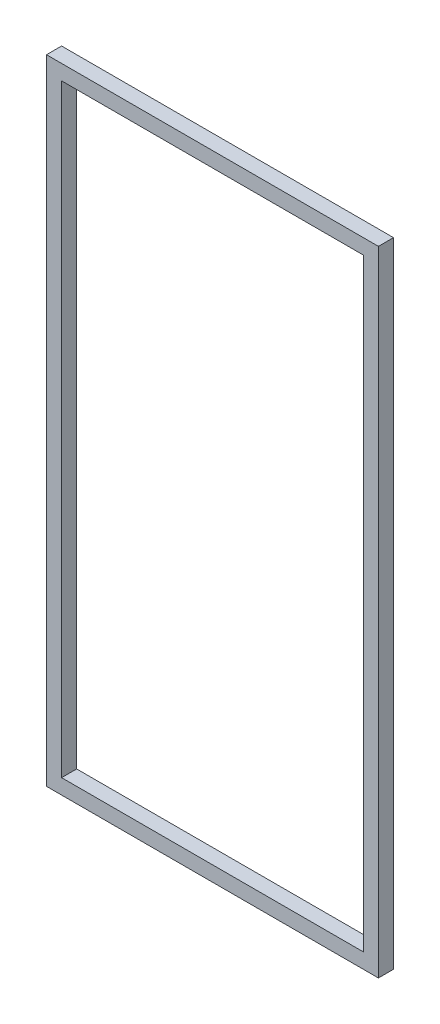
ISO-10303-21;
HEADER;
FILE_DESCRIPTION(('STEP AP214'),'2;1');
FILE_NAME('part.step','',(''),(''),'','','');
FILE_SCHEMA(('AUTOMOTIVE_DESIGN { 1 0 10303 214 1 1 1 1 }'));
ENDSEC;
DATA;
#1=APPLICATION_CONTEXT('core data for automotive mechanical design processes');
#2=APPLICATION_PROTOCOL_DEFINITION('international standard','automotive_design',2000,#1);
#3=PRODUCT_CONTEXT('',#1,'mechanical');
#4=PRODUCT('Part','Part','',(#3));
#5=PRODUCT_RELATED_PRODUCT_CATEGORY('part','',(#4));
#6=PRODUCT_DEFINITION_FORMATION('','',#4);
#7=PRODUCT_DEFINITION_CONTEXT('part definition',#1,'design');
#8=PRODUCT_DEFINITION('design','',#6,#7);
#9=PRODUCT_DEFINITION_SHAPE('','',#8);
#10=(LENGTH_UNIT() NAMED_UNIT(*) SI_UNIT(.MILLI.,.METRE.));
#11=(NAMED_UNIT(*) PLANE_ANGLE_UNIT() SI_UNIT($,.RADIAN.));
#12=(NAMED_UNIT(*) SI_UNIT($,.STERADIAN.) SOLID_ANGLE_UNIT());
#13=UNCERTAINTY_MEASURE_WITH_UNIT(LENGTH_MEASURE(1.E-05),#10,'distance_accuracy_value','');
#14=(GEOMETRIC_REPRESENTATION_CONTEXT(3) GLOBAL_UNCERTAINTY_ASSIGNED_CONTEXT((#13)) GLOBAL_UNIT_ASSIGNED_CONTEXT((#10,
#11,#12)) REPRESENTATION_CONTEXT('',''));
#15=CARTESIAN_POINT('',(0.,0.,0.));
#16=DIRECTION('',(0.,0.,1.));
#17=DIRECTION('',(1.,0.,0.));
#18=AXIS2_PLACEMENT_3D('',#15,#16,#17);
#19=CARTESIAN_POINT('',(-550.,-1050.,50.));
#20=DIRECTION('',(1.,0.,0.));
#21=DIRECTION('',(0.,0.,-1.));
#22=AXIS2_PLACEMENT_3D('',#19,#20,#21);
#23=PLANE('',#22);
#24=DIRECTION('',(0.,-1.,0.));
#25=VECTOR('',#24,1.);
#26=CARTESIAN_POINT('',(-550.,-1050.,0.));
#27=LINE('',#26,#25);
#28=CARTESIAN_POINT('',(-550.,1050.,0.));
#29=VERTEX_POINT('',#28);
#30=CARTESIAN_POINT('',(-550.,-1050.,0.));
#31=VERTEX_POINT('',#30);
#32=EDGE_CURVE('E130',#29,#31,#27,.T.);
#33=ORIENTED_EDGE('',*,*,#32,.T.);
#34=DIRECTION('',(0.,0.,-1.));
#35=VECTOR('',#34,1.);
#36=CARTESIAN_POINT('',(-550.,-1050.,50.));
#37=LINE('',#36,#35);
#38=CARTESIAN_POINT('',(-550.,-1050.,50.));
#39=VERTEX_POINT('',#38);
#40=EDGE_CURVE('E11',#39,#31,#37,.T.);
#41=ORIENTED_EDGE('',*,*,#40,.F.);
#42=DIRECTION('',(0.,-1.,0.));
#43=VECTOR('',#42,1.);
#44=CARTESIAN_POINT('',(-550.,-1050.,50.));
#45=LINE('',#44,#43);
#46=CARTESIAN_POINT('',(-550.,1050.,50.));
#47=VERTEX_POINT('',#46);
#48=EDGE_CURVE('E134',#47,#39,#45,.T.);
#49=ORIENTED_EDGE('',*,*,#48,.F.);
#50=DIRECTION('',(0.,0.,-1.));
#51=VECTOR('',#50,1.);
#52=CARTESIAN_POINT('',(-550.,1050.,50.));
#53=LINE('',#52,#51);
#54=EDGE_CURVE('E144',#47,#29,#53,.T.);
#55=ORIENTED_EDGE('',*,*,#54,.T.);
#56=EDGE_LOOP('',(#33,#41,#49,#55));
#57=FACE_BOUND('',#56,.T.);
#58=ADVANCED_FACE('F33',(#57),#23,.F.);
#59=CARTESIAN_POINT('',(550.,-1050.,50.));
#60=DIRECTION('',(0.,1.,0.));
#61=DIRECTION('',(-1.,0.,0.));
#62=AXIS2_PLACEMENT_3D('',#59,#60,#61);
#63=PLANE('',#62);
#64=DIRECTION('',(1.,0.,0.));
#65=VECTOR('',#64,1.);
#66=CARTESIAN_POINT('',(550.,-1050.,0.));
#67=LINE('',#66,#65);
#68=CARTESIAN_POINT('',(550.,-1050.,0.));
#69=VERTEX_POINT('',#68);
#70=EDGE_CURVE('E147',#31,#69,#67,.T.);
#71=ORIENTED_EDGE('',*,*,#70,.T.);
#72=DIRECTION('',(0.,0.,-1.));
#73=VECTOR('',#72,1.);
#74=CARTESIAN_POINT('',(550.,-1050.,50.));
#75=LINE('',#74,#73);
#76=CARTESIAN_POINT('',(550.,-1050.,50.));
#77=VERTEX_POINT('',#76);
#78=EDGE_CURVE('E40',#77,#69,#75,.T.);
#79=ORIENTED_EDGE('',*,*,#78,.F.);
#80=DIRECTION('',(1.,0.,0.));
#81=VECTOR('',#80,1.);
#82=CARTESIAN_POINT('',(550.,-1050.,50.));
#83=LINE('',#82,#81);
#84=EDGE_CURVE('E137',#39,#77,#83,.T.);
#85=ORIENTED_EDGE('',*,*,#84,.F.);
#86=ORIENTED_EDGE('',*,*,#40,.T.);
#87=EDGE_LOOP('',(#71,#79,#85,#86));
#88=FACE_BOUND('',#87,.T.);
#89=ADVANCED_FACE('F175',(#88),#63,.F.);
#90=CARTESIAN_POINT('',(550.,-1050.,50.));
#91=DIRECTION('',(-1.,0.,0.));
#92=DIRECTION('',(0.,0.,1.));
#93=AXIS2_PLACEMENT_3D('',#90,#91,#92);
#94=PLANE('',#93);
#95=DIRECTION('',(0.,1.,0.));
#96=VECTOR('',#95,1.);
#97=CARTESIAN_POINT('',(550.,-1050.,0.));
#98=LINE('',#97,#96);
#99=CARTESIAN_POINT('',(550.,1050.,0.));
#100=VERTEX_POINT('',#99);
#101=EDGE_CURVE('E149',#69,#100,#98,.T.);
#102=ORIENTED_EDGE('',*,*,#101,.T.);
#103=DIRECTION('',(0.,0.,-1.));
#104=VECTOR('',#103,1.);
#105=CARTESIAN_POINT('',(550.,1050.,50.));
#106=LINE('',#105,#104);
#107=CARTESIAN_POINT('',(550.,1050.,50.));
#108=VERTEX_POINT('',#107);
#109=EDGE_CURVE('E154',#108,#100,#106,.T.);
#110=ORIENTED_EDGE('',*,*,#109,.F.);
#111=DIRECTION('',(0.,1.,0.));
#112=VECTOR('',#111,1.);
#113=CARTESIAN_POINT('',(550.,-1050.,50.));
#114=LINE('',#113,#112);
#115=EDGE_CURVE('E140',#77,#108,#114,.T.);
#116=ORIENTED_EDGE('',*,*,#115,.F.);
#117=ORIENTED_EDGE('',*,*,#78,.T.);
#118=EDGE_LOOP('',(#102,#110,#116,#117));
#119=FACE_BOUND('',#118,.T.);
#120=ADVANCED_FACE('F161',(#119),#94,.F.);
#121=CARTESIAN_POINT('',(550.,1050.,50.));
#122=DIRECTION('',(0.,-1.,0.));
#123=DIRECTION('',(0.,0.,-1.));
#124=AXIS2_PLACEMENT_3D('',#121,#122,#123);
#125=PLANE('',#124);
#126=DIRECTION('',(-1.,0.,0.));
#127=VECTOR('',#126,1.);
#128=CARTESIAN_POINT('',(550.,1050.,0.));
#129=LINE('',#128,#127);
#130=EDGE_CURVE('E138',#100,#29,#129,.T.);
#131=ORIENTED_EDGE('',*,*,#130,.T.);
#132=ORIENTED_EDGE('',*,*,#54,.F.);
#133=DIRECTION('',(-1.,0.,0.));
#134=VECTOR('',#133,1.);
#135=CARTESIAN_POINT('',(550.,1050.,50.));
#136=LINE('',#135,#134);
#137=EDGE_CURVE('E142',#108,#47,#136,.T.);
#138=ORIENTED_EDGE('',*,*,#137,.F.);
#139=ORIENTED_EDGE('',*,*,#109,.T.);
#140=EDGE_LOOP('',(#131,#132,#138,#139));
#141=FACE_BOUND('',#140,.T.);
#142=ADVANCED_FACE('F168',(#141),#125,.F.);
#143=CARTESIAN_POINT('',(0.,0.,50.));
#144=DIRECTION('',(0.,0.,1.));
#145=DIRECTION('',(1.,0.,0.));
#146=AXIS2_PLACEMENT_3D('',#143,#144,#145);
#147=PLANE('',#146);
#148=DIRECTION('',(0.,-1.,0.));
#149=VECTOR('',#148,1.);
#150=CARTESIAN_POINT('',(-500.,-1000.,50.));
#151=LINE('',#150,#149);
#152=CARTESIAN_POINT('',(-500.,1000.,50.));
#153=VERTEX_POINT('',#152);
#154=CARTESIAN_POINT('',(-500.,-1000.,50.));
#155=VERTEX_POINT('',#154);
#156=EDGE_CURVE('E47',#153,#155,#151,.T.);
#157=ORIENTED_EDGE('',*,*,#156,.F.);
#158=DIRECTION('',(-1.,0.,0.));
#159=VECTOR('',#158,1.);
#160=CARTESIAN_POINT('',(500.,1000.,50.));
#161=LINE('',#160,#159);
#162=CARTESIAN_POINT('',(500.,1000.,50.));
#163=VERTEX_POINT('',#162);
#164=EDGE_CURVE('E115',#163,#153,#161,.T.);
#165=ORIENTED_EDGE('',*,*,#164,.F.);
#166=DIRECTION('',(0.,1.,0.));
#167=VECTOR('',#166,1.);
#168=CARTESIAN_POINT('',(500.,-1000.,50.));
#169=LINE('',#168,#167);
#170=CARTESIAN_POINT('',(500.,-1000.,50.));
#171=VERTEX_POINT('',#170);
#172=EDGE_CURVE('E118',#171,#163,#169,.T.);
#173=ORIENTED_EDGE('',*,*,#172,.F.);
#174=DIRECTION('',(1.,0.,0.));
#175=VECTOR('',#174,1.);
#176=CARTESIAN_POINT('',(500.,-1000.,50.));
#177=LINE('',#176,#175);
#178=EDGE_CURVE('E124',#155,#171,#177,.T.);
#179=ORIENTED_EDGE('',*,*,#178,.F.);
#180=EDGE_LOOP('',(#157,#165,#173,#179));
#181=FACE_BOUND('',#180,.T.);
#182=ORIENTED_EDGE('',*,*,#48,.T.);
#183=ORIENTED_EDGE('',*,*,#84,.T.);
#184=ORIENTED_EDGE('',*,*,#115,.T.);
#185=ORIENTED_EDGE('',*,*,#137,.T.);
#186=EDGE_LOOP('',(#182,#183,#184,#185));
#187=FACE_BOUND('',#186,.T.);
#188=ADVANCED_FACE('F174',(#181,#187),#147,.T.);
#189=CARTESIAN_POINT('',(0.,0.,0.));
#190=DIRECTION('',(0.,0.,1.));
#191=DIRECTION('',(1.,0.,0.));
#192=AXIS2_PLACEMENT_3D('',#189,#190,#191);
#193=PLANE('',#192);
#194=DIRECTION('',(-1.,0.,0.));
#195=VECTOR('',#194,1.);
#196=CARTESIAN_POINT('',(500.,1000.,0.));
#197=LINE('',#196,#195);
#198=CARTESIAN_POINT('',(500.,1000.,0.));
#199=VERTEX_POINT('',#198);
#200=CARTESIAN_POINT('',(-500.,1000.,0.));
#201=VERTEX_POINT('',#200);
#202=EDGE_CURVE('E105',#199,#201,#197,.T.);
#203=ORIENTED_EDGE('',*,*,#202,.T.);
#204=DIRECTION('',(0.,-1.,0.));
#205=VECTOR('',#204,1.);
#206=CARTESIAN_POINT('',(-500.,-1000.,0.));
#207=LINE('',#206,#205);
#208=CARTESIAN_POINT('',(-500.,-1000.,0.));
#209=VERTEX_POINT('',#208);
#210=EDGE_CURVE('E99',#201,#209,#207,.T.);
#211=ORIENTED_EDGE('',*,*,#210,.T.);
#212=DIRECTION('',(1.,0.,0.));
#213=VECTOR('',#212,1.);
#214=CARTESIAN_POINT('',(500.,-1000.,0.));
#215=LINE('',#214,#213);
#216=CARTESIAN_POINT('',(500.,-1000.,0.));
#217=VERTEX_POINT('',#216);
#218=EDGE_CURVE('E108',#209,#217,#215,.T.);
#219=ORIENTED_EDGE('',*,*,#218,.T.);
#220=DIRECTION('',(0.,1.,0.));
#221=VECTOR('',#220,1.);
#222=CARTESIAN_POINT('',(500.,-1000.,0.));
#223=LINE('',#222,#221);
#224=EDGE_CURVE('E55',#217,#199,#223,.T.);
#225=ORIENTED_EDGE('',*,*,#224,.T.);
#226=EDGE_LOOP('',(#203,#211,#219,#225));
#227=FACE_BOUND('',#226,.T.);
#228=ORIENTED_EDGE('',*,*,#32,.F.);
#229=ORIENTED_EDGE('',*,*,#130,.F.);
#230=ORIENTED_EDGE('',*,*,#101,.F.);
#231=ORIENTED_EDGE('',*,*,#70,.F.);
#232=EDGE_LOOP('',(#228,#229,#230,#231));
#233=FACE_BOUND('',#232,.T.);
#234=ADVANCED_FACE('F112',(#227,#233),#193,.F.);
#235=CARTESIAN_POINT('',(-500.,-1000.,0.));
#236=DIRECTION('',(-1.,0.,0.));
#237=DIRECTION('',(0.,0.,1.));
#238=AXIS2_PLACEMENT_3D('',#235,#236,#237);
#239=PLANE('',#238);
#240=ORIENTED_EDGE('',*,*,#156,.T.);
#241=DIRECTION('',(0.,0.,1.));
#242=VECTOR('',#241,1.);
#243=CARTESIAN_POINT('',(-500.,-1000.,0.));
#244=LINE('',#243,#242);
#245=EDGE_CURVE('E95',#209,#155,#244,.T.);
#246=ORIENTED_EDGE('',*,*,#245,.F.);
#247=ORIENTED_EDGE('',*,*,#210,.F.);
#248=DIRECTION('',(0.,0.,1.));
#249=VECTOR('',#248,1.);
#250=CARTESIAN_POINT('',(-500.,1000.,0.));
#251=LINE('',#250,#249);
#252=EDGE_CURVE('E128',#201,#153,#251,.T.);
#253=ORIENTED_EDGE('',*,*,#252,.T.);
#254=EDGE_LOOP('',(#240,#246,#247,#253));
#255=FACE_BOUND('',#254,.T.);
#256=ADVANCED_FACE('F97',(#255),#239,.F.);
#257=CARTESIAN_POINT('',(500.,1000.,0.));
#258=DIRECTION('',(0.,1.,0.));
#259=DIRECTION('',(-1.,0.,0.));
#260=AXIS2_PLACEMENT_3D('',#257,#258,#259);
#261=PLANE('',#260);
#262=ORIENTED_EDGE('',*,*,#164,.T.);
#263=ORIENTED_EDGE('',*,*,#252,.F.);
#264=ORIENTED_EDGE('',*,*,#202,.F.);
#265=DIRECTION('',(0.,0.,1.));
#266=VECTOR('',#265,1.);
#267=CARTESIAN_POINT('',(500.,1000.,0.));
#268=LINE('',#267,#266);
#269=EDGE_CURVE('E131',#199,#163,#268,.T.);
#270=ORIENTED_EDGE('',*,*,#269,.T.);
#271=EDGE_LOOP('',(#262,#263,#264,#270));
#272=FACE_BOUND('',#271,.T.);
#273=ADVANCED_FACE('F192',(#272),#261,.F.);
#274=CARTESIAN_POINT('',(500.,-1000.,0.));
#275=DIRECTION('',(1.,0.,0.));
#276=DIRECTION('',(0.,0.,-1.));
#277=AXIS2_PLACEMENT_3D('',#274,#275,#276);
#278=PLANE('',#277);
#279=ORIENTED_EDGE('',*,*,#172,.T.);
#280=ORIENTED_EDGE('',*,*,#269,.F.);
#281=ORIENTED_EDGE('',*,*,#224,.F.);
#282=DIRECTION('',(0.,0.,1.));
#283=VECTOR('',#282,1.);
#284=CARTESIAN_POINT('',(500.,-1000.,0.));
#285=LINE('',#284,#283);
#286=EDGE_CURVE('E104',#217,#171,#285,.T.);
#287=ORIENTED_EDGE('',*,*,#286,.T.);
#288=EDGE_LOOP('',(#279,#280,#281,#287));
#289=FACE_BOUND('',#288,.T.);
#290=ADVANCED_FACE('F195',(#289),#278,.F.);
#291=CARTESIAN_POINT('',(500.,-1000.,0.));
#292=DIRECTION('',(0.,-1.,0.));
#293=DIRECTION('',(1.,0.,0.));
#294=AXIS2_PLACEMENT_3D('',#291,#292,#293);
#295=PLANE('',#294);
#296=ORIENTED_EDGE('',*,*,#178,.T.);
#297=ORIENTED_EDGE('',*,*,#286,.F.);
#298=ORIENTED_EDGE('',*,*,#218,.F.);
#299=ORIENTED_EDGE('',*,*,#245,.T.);
#300=EDGE_LOOP('',(#296,#297,#298,#299));
#301=FACE_BOUND('',#300,.T.);
#302=ADVANCED_FACE('F109',(#301),#295,.F.);
#303=CLOSED_SHELL('',(#58,#89,#120,#142,#188,#234,#256,#273,#290,#302));
#304=MANIFOLD_SOLID_BREP('B2',#303);
#305=ADVANCED_BREP_SHAPE_REPRESENTATION('',(#18,#304),#14);
#306=SHAPE_DEFINITION_REPRESENTATION(#9,#305);
ENDSEC;
END-ISO-10303-21;
